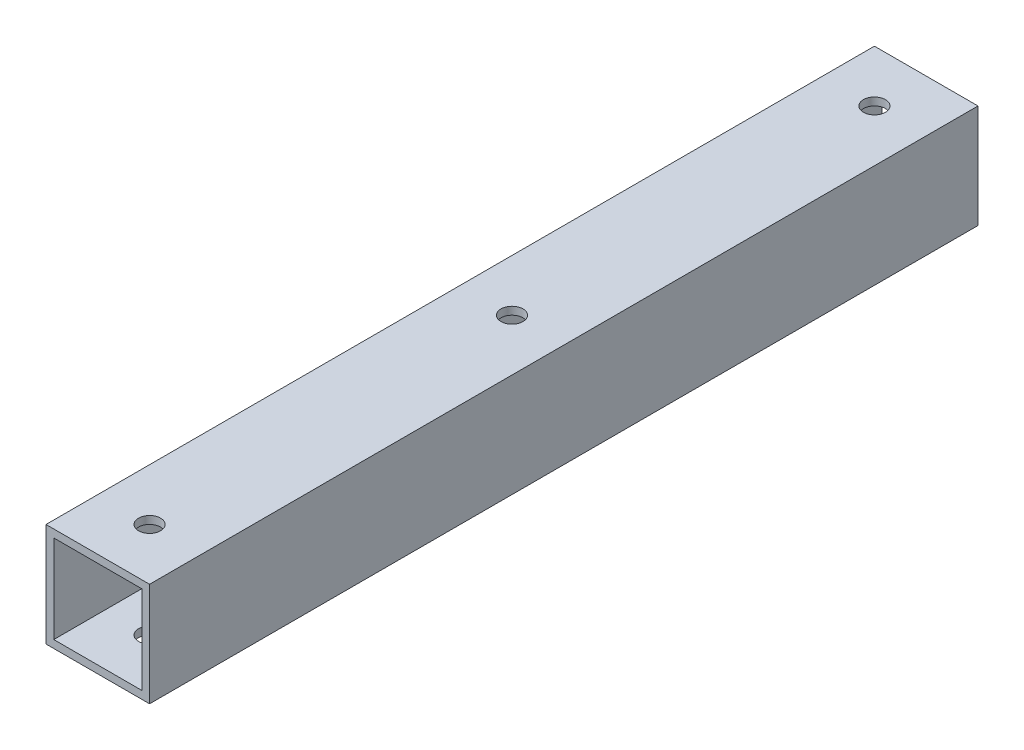
ISO-10303-21;
HEADER;
FILE_DESCRIPTION(('STEP AP214'),'2;1');
FILE_NAME('part.step','',(''),(''),'','','');
FILE_SCHEMA(('AUTOMOTIVE_DESIGN { 1 0 10303 214 1 1 1 1 }'));
ENDSEC;
DATA;
#1=APPLICATION_CONTEXT('core data for automotive mechanical design processes');
#2=APPLICATION_PROTOCOL_DEFINITION('international standard','automotive_design',2000,#1);
#3=PRODUCT_CONTEXT('',#1,'mechanical');
#4=PRODUCT('Part','Part','',(#3));
#5=PRODUCT_RELATED_PRODUCT_CATEGORY('part','',(#4));
#6=PRODUCT_DEFINITION_FORMATION('','',#4);
#7=PRODUCT_DEFINITION_CONTEXT('part definition',#1,'design');
#8=PRODUCT_DEFINITION('design','',#6,#7);
#9=PRODUCT_DEFINITION_SHAPE('','',#8);
#10=(LENGTH_UNIT() NAMED_UNIT(*) SI_UNIT(.MILLI.,.METRE.));
#11=(NAMED_UNIT(*) PLANE_ANGLE_UNIT() SI_UNIT($,.RADIAN.));
#12=(NAMED_UNIT(*) SI_UNIT($,.STERADIAN.) SOLID_ANGLE_UNIT());
#13=UNCERTAINTY_MEASURE_WITH_UNIT(LENGTH_MEASURE(1.E-05),#10,'distance_accuracy_value','');
#14=(GEOMETRIC_REPRESENTATION_CONTEXT(3) GLOBAL_UNCERTAINTY_ASSIGNED_CONTEXT((#13)) GLOBAL_UNIT_ASSIGNED_CONTEXT((#10,
#11,#12)) REPRESENTATION_CONTEXT('',''));
#15=CARTESIAN_POINT('',(0.,0.,0.));
#16=DIRECTION('',(0.,0.,1.));
#17=DIRECTION('',(1.,0.,0.));
#18=AXIS2_PLACEMENT_3D('',#15,#16,#17);
#19=CARTESIAN_POINT('',(10.,-9.99999999999999,-160.));
#20=DIRECTION('',(1.,0.,0.));
#21=DIRECTION('',(0.,0.,-1.));
#22=AXIS2_PLACEMENT_3D('',#19,#20,#21);
#23=PLANE('',#22);
#24=DIRECTION('',(0.,1.,0.));
#25=VECTOR('',#24,1.);
#26=CARTESIAN_POINT('',(10.,-9.99999999999999,0.));
#27=LINE('',#26,#25);
#28=CARTESIAN_POINT('',(10.,-9.99999999999999,0.));
#29=VERTEX_POINT('',#28);
#30=CARTESIAN_POINT('',(10.,10.,0.));
#31=VERTEX_POINT('',#30);
#32=EDGE_CURVE('E142',#29,#31,#27,.T.);
#33=ORIENTED_EDGE('',*,*,#32,.F.);
#34=DIRECTION('',(0.,0.,1.));
#35=VECTOR('',#34,1.);
#36=CARTESIAN_POINT('',(10.,-9.99999999999999,-160.));
#37=LINE('',#36,#35);
#38=CARTESIAN_POINT('',(10.,-9.99999999999999,-160.));
#39=VERTEX_POINT('',#38);
#40=EDGE_CURVE('E11',#39,#29,#37,.T.);
#41=ORIENTED_EDGE('',*,*,#40,.F.);
#42=DIRECTION('',(0.,1.,0.));
#43=VECTOR('',#42,1.);
#44=CARTESIAN_POINT('',(10.,-9.99999999999999,-160.));
#45=LINE('',#44,#43);
#46=CARTESIAN_POINT('',(10.,10.,-160.));
#47=VERTEX_POINT('',#46);
#48=EDGE_CURVE('E146',#39,#47,#45,.T.);
#49=ORIENTED_EDGE('',*,*,#48,.T.);
#50=DIRECTION('',(0.,0.,1.));
#51=VECTOR('',#50,1.);
#52=CARTESIAN_POINT('',(10.,10.,-160.));
#53=LINE('',#52,#51);
#54=EDGE_CURVE('E159',#47,#31,#53,.T.);
#55=ORIENTED_EDGE('',*,*,#54,.T.);
#56=EDGE_LOOP('',(#33,#41,#49,#55));
#57=FACE_BOUND('',#56,.T.);
#58=ADVANCED_FACE('F41',(#57),#23,.T.);
#59=CARTESIAN_POINT('',(-9.99999999999998,-9.99999999999999,-160.));
#60=DIRECTION('',(0.,-1.,0.));
#61=DIRECTION('',(0.,0.,-1.));
#62=AXIS2_PLACEMENT_3D('',#59,#60,#61);
#63=PLANE('',#62);
#64=CARTESIAN_POINT('',(0.,-9.99999999999999,-10.));
#65=DIRECTION('',(0.,1.,0.));
#66=DIRECTION('',(0.,0.,1.));
#67=AXIS2_PLACEMENT_3D('',#64,#65,#66);
#68=CIRCLE('',#67,2.125);
#69=CARTESIAN_POINT('',(0.,-9.99999999999999,-7.875));
#70=VERTEX_POINT('',#69);
#71=EDGE_CURVE('E177',#70,#70,#68,.T.);
#72=ORIENTED_EDGE('',*,*,#71,.T.);
#73=EDGE_LOOP('',(#72));
#74=FACE_BOUND('',#73,.T.);
#75=CARTESIAN_POINT('',(-2.40117429922004E-13,-9.99999999999999,-80.));
#76=DIRECTION('',(0.,1.,0.));
#77=DIRECTION('',(0.,0.,1.));
#78=AXIS2_PLACEMENT_3D('',#75,#76,#77);
#79=CIRCLE('',#78,2.125);
#80=CARTESIAN_POINT('',(-2.40117429922004E-13,-9.99999999999999,-77.875));
#81=VERTEX_POINT('',#80);
#82=EDGE_CURVE('E195',#81,#81,#79,.T.);
#83=ORIENTED_EDGE('',*,*,#82,.T.);
#84=EDGE_LOOP('',(#83));
#85=FACE_BOUND('',#84,.T.);
#86=CARTESIAN_POINT('',(-4.80234859844007E-13,-9.99999999999999,-150.));
#87=DIRECTION('',(0.,1.,0.));
#88=DIRECTION('',(0.,0.,1.));
#89=AXIS2_PLACEMENT_3D('',#86,#87,#88);
#90=CIRCLE('',#89,2.125);
#91=CARTESIAN_POINT('',(-4.80234859844007E-13,-9.99999999999999,-147.875));
#92=VERTEX_POINT('',#91);
#93=EDGE_CURVE('E189',#92,#92,#90,.T.);
#94=ORIENTED_EDGE('',*,*,#93,.T.);
#95=EDGE_LOOP('',(#94));
#96=FACE_BOUND('',#95,.T.);
#97=DIRECTION('',(1.,0.,0.));
#98=VECTOR('',#97,1.);
#99=CARTESIAN_POINT('',(-9.99999999999998,-9.99999999999999,0.));
#100=LINE('',#99,#98);
#101=CARTESIAN_POINT('',(-9.99999999999998,-9.99999999999999,0.));
#102=VERTEX_POINT('',#101);
#103=EDGE_CURVE('E150',#102,#29,#100,.T.);
#104=ORIENTED_EDGE('',*,*,#103,.F.);
#105=DIRECTION('',(0.,0.,1.));
#106=VECTOR('',#105,1.);
#107=CARTESIAN_POINT('',(-9.99999999999998,-9.99999999999999,-160.));
#108=LINE('',#107,#106);
#109=CARTESIAN_POINT('',(-9.99999999999998,-9.99999999999999,-160.));
#110=VERTEX_POINT('',#109);
#111=EDGE_CURVE('E49',#110,#102,#108,.T.);
#112=ORIENTED_EDGE('',*,*,#111,.F.);
#113=DIRECTION('',(1.,0.,0.));
#114=VECTOR('',#113,1.);
#115=CARTESIAN_POINT('',(-9.99999999999998,-9.99999999999999,-160.));
#116=LINE('',#115,#114);
#117=EDGE_CURVE('E156',#110,#39,#116,.T.);
#118=ORIENTED_EDGE('',*,*,#117,.T.);
#119=ORIENTED_EDGE('',*,*,#40,.T.);
#120=EDGE_LOOP('',(#104,#112,#118,#119));
#121=FACE_BOUND('',#120,.T.);
#122=ADVANCED_FACE('F207',(#74,#85,#96,#121),#63,.T.);
#123=CARTESIAN_POINT('',(-9.99999999999998,-9.99999999999999,-160.));
#124=DIRECTION('',(-1.,0.,0.));
#125=DIRECTION('',(0.,0.,1.));
#126=AXIS2_PLACEMENT_3D('',#123,#124,#125);
#127=PLANE('',#126);
#128=DIRECTION('',(0.,-1.,0.));
#129=VECTOR('',#128,1.);
#130=CARTESIAN_POINT('',(-9.99999999999998,-9.99999999999999,0.));
#131=LINE('',#130,#129);
#132=CARTESIAN_POINT('',(-9.99999999999998,10.,0.));
#133=VERTEX_POINT('',#132);
#134=EDGE_CURVE('E165',#133,#102,#131,.T.);
#135=ORIENTED_EDGE('',*,*,#134,.F.);
#136=DIRECTION('',(0.,0.,1.));
#137=VECTOR('',#136,1.);
#138=CARTESIAN_POINT('',(-9.99999999999998,10.,-160.));
#139=LINE('',#138,#137);
#140=CARTESIAN_POINT('',(-9.99999999999998,10.,-160.));
#141=VERTEX_POINT('',#140);
#142=EDGE_CURVE('E171',#141,#133,#139,.T.);
#143=ORIENTED_EDGE('',*,*,#142,.F.);
#144=DIRECTION('',(0.,-1.,0.));
#145=VECTOR('',#144,1.);
#146=CARTESIAN_POINT('',(-9.99999999999998,-9.99999999999999,-160.));
#147=LINE('',#146,#145);
#148=EDGE_CURVE('E153',#141,#110,#147,.T.);
#149=ORIENTED_EDGE('',*,*,#148,.T.);
#150=ORIENTED_EDGE('',*,*,#111,.T.);
#151=EDGE_LOOP('',(#135,#143,#149,#150));
#152=FACE_BOUND('',#151,.T.);
#153=ADVANCED_FACE('F240',(#152),#127,.T.);
#154=CARTESIAN_POINT('',(-9.99999999999998,10.,-160.));
#155=DIRECTION('',(0.,1.,0.));
#156=DIRECTION('',(0.,0.,1.));
#157=AXIS2_PLACEMENT_3D('',#154,#155,#156);
#158=PLANE('',#157);
#159=CARTESIAN_POINT('',(0.,10.,-10.));
#160=DIRECTION('',(0.,1.,0.));
#161=DIRECTION('',(0.,0.,1.));
#162=AXIS2_PLACEMENT_3D('',#159,#160,#161);
#163=CIRCLE('',#162,2.125);
#164=CARTESIAN_POINT('',(0.,10.,-7.875));
#165=VERTEX_POINT('',#164);
#166=EDGE_CURVE('E201',#165,#165,#163,.T.);
#167=ORIENTED_EDGE('',*,*,#166,.F.);
#168=EDGE_LOOP('',(#167));
#169=FACE_BOUND('',#168,.T.);
#170=CARTESIAN_POINT('',(-2.40117429922004E-13,10.,-80.));
#171=DIRECTION('',(0.,1.,0.));
#172=DIRECTION('',(0.,0.,1.));
#173=AXIS2_PLACEMENT_3D('',#170,#171,#172);
#174=CIRCLE('',#173,2.125);
#175=CARTESIAN_POINT('',(-2.40117429922004E-13,10.,-77.875));
#176=VERTEX_POINT('',#175);
#177=EDGE_CURVE('E198',#176,#176,#174,.T.);
#178=ORIENTED_EDGE('',*,*,#177,.F.);
#179=EDGE_LOOP('',(#178));
#180=FACE_BOUND('',#179,.T.);
#181=CARTESIAN_POINT('',(-4.80234859844007E-13,10.,-150.));
#182=DIRECTION('',(0.,1.,0.));
#183=DIRECTION('',(0.,0.,1.));
#184=AXIS2_PLACEMENT_3D('',#181,#182,#183);
#185=CIRCLE('',#184,2.125);
#186=CARTESIAN_POINT('',(-4.80234859844007E-13,10.,-147.875));
#187=VERTEX_POINT('',#186);
#188=EDGE_CURVE('E192',#187,#187,#185,.T.);
#189=ORIENTED_EDGE('',*,*,#188,.F.);
#190=EDGE_LOOP('',(#189));
#191=FACE_BOUND('',#190,.T.);
#192=DIRECTION('',(-1.,0.,0.));
#193=VECTOR('',#192,1.);
#194=CARTESIAN_POINT('',(-9.99999999999998,10.,0.));
#195=LINE('',#194,#193);
#196=EDGE_CURVE('E162',#31,#133,#195,.T.);
#197=ORIENTED_EDGE('',*,*,#196,.F.);
#198=ORIENTED_EDGE('',*,*,#54,.F.);
#199=DIRECTION('',(-1.,0.,0.));
#200=VECTOR('',#199,1.);
#201=CARTESIAN_POINT('',(-9.99999999999998,10.,-160.));
#202=LINE('',#201,#200);
#203=EDGE_CURVE('E149',#47,#141,#202,.T.);
#204=ORIENTED_EDGE('',*,*,#203,.T.);
#205=ORIENTED_EDGE('',*,*,#142,.T.);
#206=EDGE_LOOP('',(#197,#198,#204,#205));
#207=FACE_BOUND('',#206,.T.);
#208=ADVANCED_FACE('F254',(#169,#180,#191,#207),#158,.T.);
#209=CARTESIAN_POINT('',(0.,0.,-160.));
#210=DIRECTION('',(0.,0.,-1.));
#211=DIRECTION('',(-1.,0.,0.));
#212=AXIS2_PLACEMENT_3D('',#209,#210,#211);
#213=PLANE('',#212);
#214=DIRECTION('',(0.,-1.,0.));
#215=VECTOR('',#214,1.);
#216=CARTESIAN_POINT('',(-8.49999999999998,-8.49999999999999,-160.));
#217=LINE('',#216,#215);
#218=CARTESIAN_POINT('',(-8.49999999999998,8.50000000000002,-160.));
#219=VERTEX_POINT('',#218);
#220=CARTESIAN_POINT('',(-8.49999999999998,-8.49999999999999,-160.));
#221=VERTEX_POINT('',#220);
#222=EDGE_CURVE('E108',#219,#221,#217,.T.);
#223=ORIENTED_EDGE('',*,*,#222,.T.);
#224=DIRECTION('',(1.,0.,0.));
#225=VECTOR('',#224,1.);
#226=CARTESIAN_POINT('',(-8.49999999999998,-8.49999999999999,-160.));
#227=LINE('',#226,#225);
#228=CARTESIAN_POINT('',(8.50000000000002,-8.49999999999999,-160.));
#229=VERTEX_POINT('',#228);
#230=EDGE_CURVE('E117',#221,#229,#227,.T.);
#231=ORIENTED_EDGE('',*,*,#230,.T.);
#232=DIRECTION('',(0.,1.,0.));
#233=VECTOR('',#232,1.);
#234=CARTESIAN_POINT('',(8.50000000000002,-8.49999999999999,-160.));
#235=LINE('',#234,#233);
#236=CARTESIAN_POINT('',(8.50000000000002,8.50000000000002,-160.));
#237=VERTEX_POINT('',#236);
#238=EDGE_CURVE('E57',#229,#237,#235,.T.);
#239=ORIENTED_EDGE('',*,*,#238,.T.);
#240=DIRECTION('',(-1.,0.,0.));
#241=VECTOR('',#240,1.);
#242=CARTESIAN_POINT('',(-8.49999999999998,8.50000000000002,-160.));
#243=LINE('',#242,#241);
#244=EDGE_CURVE('E114',#237,#219,#243,.T.);
#245=ORIENTED_EDGE('',*,*,#244,.T.);
#246=EDGE_LOOP('',(#223,#231,#239,#245));
#247=FACE_BOUND('',#246,.T.);
#248=ORIENTED_EDGE('',*,*,#48,.F.);
#249=ORIENTED_EDGE('',*,*,#117,.F.);
#250=ORIENTED_EDGE('',*,*,#148,.F.);
#251=ORIENTED_EDGE('',*,*,#203,.F.);
#252=EDGE_LOOP('',(#248,#249,#250,#251));
#253=FACE_BOUND('',#252,.T.);
#254=ADVANCED_FACE('F121',(#247,#253),#213,.T.);
#255=CARTESIAN_POINT('',(0.,0.,0.));
#256=DIRECTION('',(0.,0.,-1.));
#257=DIRECTION('',(-1.,0.,0.));
#258=AXIS2_PLACEMENT_3D('',#255,#256,#257);
#259=PLANE('',#258);
#260=DIRECTION('',(1.,0.,0.));
#261=VECTOR('',#260,1.);
#262=CARTESIAN_POINT('',(-8.49999999999998,-8.49999999999999,0.));
#263=LINE('',#262,#261);
#264=CARTESIAN_POINT('',(-8.49999999999998,-8.49999999999999,0.));
#265=VERTEX_POINT('',#264);
#266=CARTESIAN_POINT('',(8.50000000000002,-8.49999999999999,0.));
#267=VERTEX_POINT('',#266);
#268=EDGE_CURVE('E136',#265,#267,#263,.T.);
#269=ORIENTED_EDGE('',*,*,#268,.F.);
#270=DIRECTION('',(0.,-1.,0.));
#271=VECTOR('',#270,1.);
#272=CARTESIAN_POINT('',(-8.49999999999998,-8.49999999999999,0.));
#273=LINE('',#272,#271);
#274=CARTESIAN_POINT('',(-8.49999999999998,8.50000000000002,0.));
#275=VERTEX_POINT('',#274);
#276=EDGE_CURVE('E65',#275,#265,#273,.T.);
#277=ORIENTED_EDGE('',*,*,#276,.F.);
#278=DIRECTION('',(-1.,0.,0.));
#279=VECTOR('',#278,1.);
#280=CARTESIAN_POINT('',(-8.49999999999998,8.50000000000002,0.));
#281=LINE('',#280,#279);
#282=CARTESIAN_POINT('',(8.50000000000002,8.50000000000002,0.));
#283=VERTEX_POINT('',#282);
#284=EDGE_CURVE('E124',#283,#275,#281,.T.);
#285=ORIENTED_EDGE('',*,*,#284,.F.);
#286=DIRECTION('',(0.,1.,0.));
#287=VECTOR('',#286,1.);
#288=CARTESIAN_POINT('',(8.50000000000002,-8.49999999999999,0.));
#289=LINE('',#288,#287);
#290=EDGE_CURVE('E127',#267,#283,#289,.T.);
#291=ORIENTED_EDGE('',*,*,#290,.F.);
#292=EDGE_LOOP('',(#269,#277,#285,#291));
#293=FACE_BOUND('',#292,.T.);
#294=ORIENTED_EDGE('',*,*,#32,.T.);
#295=ORIENTED_EDGE('',*,*,#196,.T.);
#296=ORIENTED_EDGE('',*,*,#134,.T.);
#297=ORIENTED_EDGE('',*,*,#103,.T.);
#298=EDGE_LOOP('',(#294,#295,#296,#297));
#299=FACE_BOUND('',#298,.T.);
#300=ADVANCED_FACE('F247',(#293,#299),#259,.F.);
#301=CARTESIAN_POINT('',(-8.49999999999998,-8.49999999999999,-160.));
#302=DIRECTION('',(-1.,0.,0.));
#303=DIRECTION('',(0.,0.,1.));
#304=AXIS2_PLACEMENT_3D('',#301,#302,#303);
#305=PLANE('',#304);
#306=ORIENTED_EDGE('',*,*,#276,.T.);
#307=DIRECTION('',(0.,0.,1.));
#308=VECTOR('',#307,1.);
#309=CARTESIAN_POINT('',(-8.49999999999998,-8.49999999999999,-160.));
#310=LINE('',#309,#308);
#311=EDGE_CURVE('E104',#221,#265,#310,.T.);
#312=ORIENTED_EDGE('',*,*,#311,.F.);
#313=ORIENTED_EDGE('',*,*,#222,.F.);
#314=DIRECTION('',(0.,0.,1.));
#315=VECTOR('',#314,1.);
#316=CARTESIAN_POINT('',(-8.49999999999998,8.50000000000002,-160.));
#317=LINE('',#316,#315);
#318=EDGE_CURVE('E140',#219,#275,#317,.T.);
#319=ORIENTED_EDGE('',*,*,#318,.T.);
#320=EDGE_LOOP('',(#306,#312,#313,#319));
#321=FACE_BOUND('',#320,.T.);
#322=ADVANCED_FACE('F106',(#321),#305,.F.);
#323=CARTESIAN_POINT('',(-8.49999999999998,8.50000000000002,-160.));
#324=DIRECTION('',(0.,1.,0.));
#325=DIRECTION('',(0.,0.,1.));
#326=AXIS2_PLACEMENT_3D('',#323,#324,#325);
#327=PLANE('',#326);
#328=CARTESIAN_POINT('',(0.,8.50000000000002,-10.));
#329=DIRECTION('',(0.,1.,0.));
#330=DIRECTION('',(0.,0.,1.));
#331=AXIS2_PLACEMENT_3D('',#328,#329,#330);
#332=CIRCLE('',#331,2.125);
#333=CARTESIAN_POINT('',(0.,8.50000000000002,-7.875));
#334=VERTEX_POINT('',#333);
#335=EDGE_CURVE('E130',#334,#334,#332,.T.);
#336=ORIENTED_EDGE('',*,*,#335,.T.);
#337=EDGE_LOOP('',(#336));
#338=FACE_BOUND('',#337,.T.);
#339=CARTESIAN_POINT('',(-2.40117429922004E-13,8.50000000000002,-80.));
#340=DIRECTION('',(0.,1.,0.));
#341=DIRECTION('',(0.,0.,1.));
#342=AXIS2_PLACEMENT_3D('',#339,#340,#341);
#343=CIRCLE('',#342,2.125);
#344=CARTESIAN_POINT('',(-2.40117429922004E-13,8.50000000000002,-77.875));
#345=VERTEX_POINT('',#344);
#346=EDGE_CURVE('E180',#345,#345,#343,.T.);
#347=ORIENTED_EDGE('',*,*,#346,.T.);
#348=EDGE_LOOP('',(#347));
#349=FACE_BOUND('',#348,.T.);
#350=CARTESIAN_POINT('',(-4.80234859844007E-13,8.50000000000002,-150.));
#351=DIRECTION('',(0.,1.,0.));
#352=DIRECTION('',(0.,0.,1.));
#353=AXIS2_PLACEMENT_3D('',#350,#351,#352);
#354=CIRCLE('',#353,2.125);
#355=CARTESIAN_POINT('',(-4.80234859844007E-13,8.50000000000002,-147.875));
#356=VERTEX_POINT('',#355);
#357=EDGE_CURVE('E176',#356,#356,#354,.T.);
#358=ORIENTED_EDGE('',*,*,#357,.T.);
#359=EDGE_LOOP('',(#358));
#360=FACE_BOUND('',#359,.T.);
#361=ORIENTED_EDGE('',*,*,#284,.T.);
#362=ORIENTED_EDGE('',*,*,#318,.F.);
#363=ORIENTED_EDGE('',*,*,#244,.F.);
#364=DIRECTION('',(0.,0.,1.));
#365=VECTOR('',#364,1.);
#366=CARTESIAN_POINT('',(8.50000000000002,8.50000000000002,-160.));
#367=LINE('',#366,#365);
#368=EDGE_CURVE('E143',#237,#283,#367,.T.);
#369=ORIENTED_EDGE('',*,*,#368,.T.);
#370=EDGE_LOOP('',(#361,#362,#363,#369));
#371=FACE_BOUND('',#370,.T.);
#372=ADVANCED_FACE('F223',(#338,#349,#360,#371),#327,.F.);
#373=CARTESIAN_POINT('',(8.50000000000002,-8.49999999999999,-160.));
#374=DIRECTION('',(1.,0.,0.));
#375=DIRECTION('',(0.,0.,-1.));
#376=AXIS2_PLACEMENT_3D('',#373,#374,#375);
#377=PLANE('',#376);
#378=ORIENTED_EDGE('',*,*,#290,.T.);
#379=ORIENTED_EDGE('',*,*,#368,.F.);
#380=ORIENTED_EDGE('',*,*,#238,.F.);
#381=DIRECTION('',(0.,0.,1.));
#382=VECTOR('',#381,1.);
#383=CARTESIAN_POINT('',(8.50000000000002,-8.49999999999999,-160.));
#384=LINE('',#383,#382);
#385=EDGE_CURVE('E113',#229,#267,#384,.T.);
#386=ORIENTED_EDGE('',*,*,#385,.T.);
#387=EDGE_LOOP('',(#378,#379,#380,#386));
#388=FACE_BOUND('',#387,.T.);
#389=ADVANCED_FACE('F272',(#388),#377,.F.);
#390=CARTESIAN_POINT('',(-8.49999999999998,-8.49999999999999,-160.));
#391=DIRECTION('',(0.,-1.,0.));
#392=DIRECTION('',(0.,0.,-1.));
#393=AXIS2_PLACEMENT_3D('',#390,#391,#392);
#394=PLANE('',#393);
#395=CARTESIAN_POINT('',(0.,-8.49999999999999,-10.));
#396=DIRECTION('',(0.,-1.,0.));
#397=DIRECTION('',(0.,0.,-1.));
#398=AXIS2_PLACEMENT_3D('',#395,#396,#397);
#399=CIRCLE('',#398,2.125);
#400=CARTESIAN_POINT('',(0.,-8.49999999999999,-12.125));
#401=VERTEX_POINT('',#400);
#402=EDGE_CURVE('E44',#401,#401,#399,.T.);
#403=ORIENTED_EDGE('',*,*,#402,.T.);
#404=EDGE_LOOP('',(#403));
#405=FACE_BOUND('',#404,.T.);
#406=CARTESIAN_POINT('',(-2.40117429922004E-13,-8.49999999999999,-80.));
#407=DIRECTION('',(0.,-1.,0.));
#408=DIRECTION('',(0.,0.,-1.));
#409=AXIS2_PLACEMENT_3D('',#406,#407,#408);
#410=CIRCLE('',#409,2.125);
#411=CARTESIAN_POINT('',(-2.40117429922004E-13,-8.49999999999999,-82.125));
#412=VERTEX_POINT('',#411);
#413=EDGE_CURVE('E178',#412,#412,#410,.T.);
#414=ORIENTED_EDGE('',*,*,#413,.T.);
#415=EDGE_LOOP('',(#414));
#416=FACE_BOUND('',#415,.T.);
#417=CARTESIAN_POINT('',(-4.80234859844007E-13,-8.49999999999999,-150.));
#418=DIRECTION('',(0.,-1.,0.));
#419=DIRECTION('',(0.,0.,-1.));
#420=AXIS2_PLACEMENT_3D('',#417,#418,#419);
#421=CIRCLE('',#420,2.125);
#422=CARTESIAN_POINT('',(-4.80234859844007E-13,-8.49999999999999,-152.125));
#423=VERTEX_POINT('',#422);
#424=EDGE_CURVE('E174',#423,#423,#421,.T.);
#425=ORIENTED_EDGE('',*,*,#424,.T.);
#426=EDGE_LOOP('',(#425));
#427=FACE_BOUND('',#426,.T.);
#428=ORIENTED_EDGE('',*,*,#268,.T.);
#429=ORIENTED_EDGE('',*,*,#385,.F.);
#430=ORIENTED_EDGE('',*,*,#230,.F.);
#431=ORIENTED_EDGE('',*,*,#311,.T.);
#432=EDGE_LOOP('',(#428,#429,#430,#431));
#433=FACE_BOUND('',#432,.T.);
#434=ADVANCED_FACE('F118',(#405,#416,#427,#433),#394,.F.);
#435=CARTESIAN_POINT('',(-4.80234859844007E-13,-9.99999999999999,-150.));
#436=DIRECTION('',(0.,1.,0.));
#437=DIRECTION('',(0.,0.,1.));
#438=AXIS2_PLACEMENT_3D('',#435,#436,#437);
#439=CYLINDRICAL_SURFACE('',#438,2.125);
#440=ORIENTED_EDGE('',*,*,#93,.F.);
#441=EDGE_LOOP('',(#440));
#442=FACE_BOUND('',#441,.T.);
#443=ORIENTED_EDGE('',*,*,#424,.F.);
#444=EDGE_LOOP('',(#443));
#445=FACE_BOUND('',#444,.T.);
#446=ADVANCED_FACE('F271',(#442,#445),#439,.F.);
#447=CARTESIAN_POINT('',(-2.40117429922004E-13,-9.99999999999999,-80.));
#448=DIRECTION('',(0.,1.,0.));
#449=DIRECTION('',(0.,0.,1.));
#450=AXIS2_PLACEMENT_3D('',#447,#448,#449);
#451=CYLINDRICAL_SURFACE('',#450,2.125);
#452=ORIENTED_EDGE('',*,*,#82,.F.);
#453=EDGE_LOOP('',(#452));
#454=FACE_BOUND('',#453,.T.);
#455=ORIENTED_EDGE('',*,*,#413,.F.);
#456=EDGE_LOOP('',(#455));
#457=FACE_BOUND('',#456,.T.);
#458=ADVANCED_FACE('F214',(#454,#457),#451,.F.);
#459=CARTESIAN_POINT('',(0.,-9.99999999999999,-10.));
#460=DIRECTION('',(0.,1.,0.));
#461=DIRECTION('',(0.,0.,1.));
#462=AXIS2_PLACEMENT_3D('',#459,#460,#461);
#463=CYLINDRICAL_SURFACE('',#462,2.125);
#464=ORIENTED_EDGE('',*,*,#71,.F.);
#465=EDGE_LOOP('',(#464));
#466=FACE_BOUND('',#465,.T.);
#467=ORIENTED_EDGE('',*,*,#402,.F.);
#468=EDGE_LOOP('',(#467));
#469=FACE_BOUND('',#468,.T.);
#470=ADVANCED_FACE('F210',(#466,#469),#463,.F.);
#471=ORIENTED_EDGE('',*,*,#188,.T.);
#472=EDGE_LOOP('',(#471));
#473=FACE_BOUND('',#472,.T.);
#474=ORIENTED_EDGE('',*,*,#357,.F.);
#475=EDGE_LOOP('',(#474));
#476=FACE_BOUND('',#475,.T.);
#477=ADVANCED_FACE('F213',(#473,#476),#439,.F.);
#478=ORIENTED_EDGE('',*,*,#177,.T.);
#479=EDGE_LOOP('',(#478));
#480=FACE_BOUND('',#479,.T.);
#481=ORIENTED_EDGE('',*,*,#346,.F.);
#482=EDGE_LOOP('',(#481));
#483=FACE_BOUND('',#482,.T.);
#484=ADVANCED_FACE('F227',(#480,#483),#451,.F.);
#485=ORIENTED_EDGE('',*,*,#166,.T.);
#486=EDGE_LOOP('',(#485));
#487=FACE_BOUND('',#486,.T.);
#488=ORIENTED_EDGE('',*,*,#335,.F.);
#489=EDGE_LOOP('',(#488));
#490=FACE_BOUND('',#489,.T.);
#491=ADVANCED_FACE('F216',(#487,#490),#463,.F.);
#492=CLOSED_SHELL('',(#58,#122,#153,#208,#254,#300,#322,#372,#389,#434,#446,#458,#470,#477,#484,#491));
#493=MANIFOLD_SOLID_BREP('B2',#492);
#494=ADVANCED_BREP_SHAPE_REPRESENTATION('',(#18,#493),#14);
#495=SHAPE_DEFINITION_REPRESENTATION(#9,#494);
ENDSEC;
END-ISO-10303-21;
